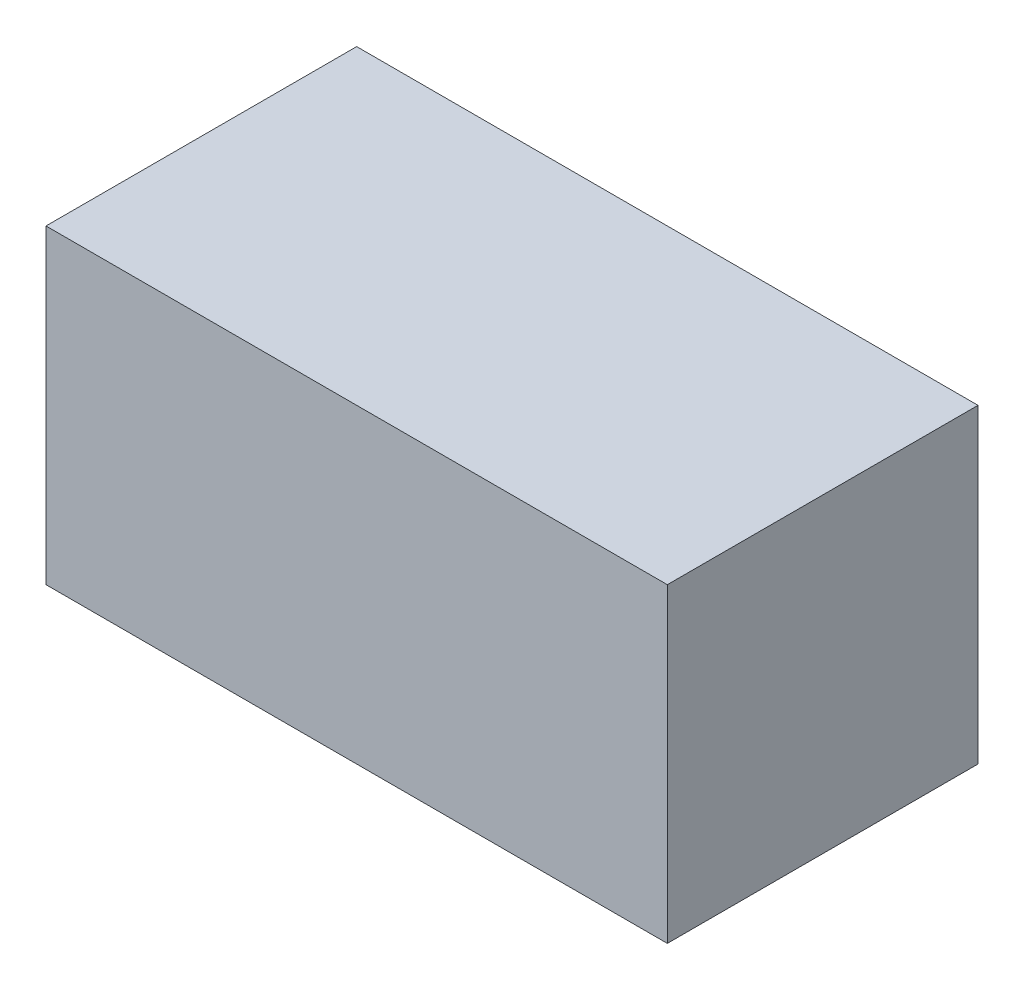
ISO-10303-21;
HEADER;
FILE_DESCRIPTION(('STEP AP214'),'2;1');
FILE_NAME('part.step','',(''),(''),'','','');
FILE_SCHEMA(('AUTOMOTIVE_DESIGN { 1 0 10303 214 1 1 1 1 }'));
ENDSEC;
DATA;
#1=APPLICATION_CONTEXT('core data for automotive mechanical design processes');
#2=APPLICATION_PROTOCOL_DEFINITION('international standard','automotive_design',2000,#1);
#3=PRODUCT_CONTEXT('',#1,'mechanical');
#4=PRODUCT('Part','Part','',(#3));
#5=PRODUCT_RELATED_PRODUCT_CATEGORY('part','',(#4));
#6=PRODUCT_DEFINITION_FORMATION('','',#4);
#7=PRODUCT_DEFINITION_CONTEXT('part definition',#1,'design');
#8=PRODUCT_DEFINITION('design','',#6,#7);
#9=PRODUCT_DEFINITION_SHAPE('','',#8);
#10=(LENGTH_UNIT() NAMED_UNIT(*) SI_UNIT(.MILLI.,.METRE.));
#11=(NAMED_UNIT(*) PLANE_ANGLE_UNIT() SI_UNIT($,.RADIAN.));
#12=(NAMED_UNIT(*) SI_UNIT($,.STERADIAN.) SOLID_ANGLE_UNIT());
#13=UNCERTAINTY_MEASURE_WITH_UNIT(LENGTH_MEASURE(1.E-05),#10,'distance_accuracy_value','');
#14=(GEOMETRIC_REPRESENTATION_CONTEXT(3) GLOBAL_UNCERTAINTY_ASSIGNED_CONTEXT((#13)) GLOBAL_UNIT_ASSIGNED_CONTEXT((#10,
#11,#12)) REPRESENTATION_CONTEXT('',''));
#15=CARTESIAN_POINT('',(0.,0.,0.));
#16=DIRECTION('',(0.,0.,1.));
#17=DIRECTION('',(1.,0.,0.));
#18=AXIS2_PLACEMENT_3D('',#15,#16,#17);
#19=CARTESIAN_POINT('',(-487.279843444227,500.,-247.553816046967));
#20=DIRECTION('',(1.,0.,0.));
#21=DIRECTION('',(0.,0.,-1.));
#22=AXIS2_PLACEMENT_3D('',#19,#20,#21);
#23=PLANE('',#22);
#24=DIRECTION('',(0.,0.,1.));
#25=VECTOR('',#24,1.);
#26=CARTESIAN_POINT('',(-487.279843444227,0.,-247.553816046967));
#27=LINE('',#26,#25);
#28=CARTESIAN_POINT('',(-487.279843444227,0.,-247.553816046967));
#29=VERTEX_POINT('',#28);
#30=CARTESIAN_POINT('',(-487.279843444227,0.,252.446183953033));
#31=VERTEX_POINT('',#30);
#32=EDGE_CURVE('E95',#29,#31,#27,.T.);
#33=ORIENTED_EDGE('',*,*,#32,.T.);
#34=DIRECTION('',(0.,-1.,0.));
#35=VECTOR('',#34,1.);
#36=CARTESIAN_POINT('',(-487.279843444227,500.,252.446183953033));
#37=LINE('',#36,#35);
#38=CARTESIAN_POINT('',(-487.279843444227,500.,252.446183953033));
#39=VERTEX_POINT('',#38);
#40=EDGE_CURVE('E11',#39,#31,#37,.T.);
#41=ORIENTED_EDGE('',*,*,#40,.F.);
#42=DIRECTION('',(0.,0.,1.));
#43=VECTOR('',#42,1.);
#44=CARTESIAN_POINT('',(-487.279843444227,500.,-247.553816046967));
#45=LINE('',#44,#43);
#46=CARTESIAN_POINT('',(-487.279843444227,500.,-247.553816046967));
#47=VERTEX_POINT('',#46);
#48=EDGE_CURVE('E83',#47,#39,#45,.T.);
#49=ORIENTED_EDGE('',*,*,#48,.F.);
#50=DIRECTION('',(0.,-1.,0.));
#51=VECTOR('',#50,1.);
#52=CARTESIAN_POINT('',(-487.279843444227,500.,-247.553816046967));
#53=LINE('',#52,#51);
#54=EDGE_CURVE('E91',#47,#29,#53,.T.);
#55=ORIENTED_EDGE('',*,*,#54,.T.);
#56=EDGE_LOOP('',(#33,#41,#49,#55));
#57=FACE_BOUND('',#56,.T.);
#58=ADVANCED_FACE('F32',(#57),#23,.F.);
#59=CARTESIAN_POINT('',(-487.279843444227,500.,252.446183953033));
#60=DIRECTION('',(0.,0.,-1.));
#61=DIRECTION('',(-1.,0.,0.));
#62=AXIS2_PLACEMENT_3D('',#59,#60,#61);
#63=PLANE('',#62);
#64=DIRECTION('',(1.,0.,0.));
#65=VECTOR('',#64,1.);
#66=CARTESIAN_POINT('',(-487.279843444227,0.,252.446183953033));
#67=LINE('',#66,#65);
#68=CARTESIAN_POINT('',(512.720156555773,0.,252.446183953033));
#69=VERTEX_POINT('',#68);
#70=EDGE_CURVE('E87',#31,#69,#67,.T.);
#71=ORIENTED_EDGE('',*,*,#70,.T.);
#72=DIRECTION('',(0.,-1.,0.));
#73=VECTOR('',#72,1.);
#74=CARTESIAN_POINT('',(512.720156555773,500.,252.446183953033));
#75=LINE('',#74,#73);
#76=CARTESIAN_POINT('',(512.720156555773,500.,252.446183953033));
#77=VERTEX_POINT('',#76);
#78=EDGE_CURVE('E40',#77,#69,#75,.T.);
#79=ORIENTED_EDGE('',*,*,#78,.F.);
#80=DIRECTION('',(1.,0.,0.));
#81=VECTOR('',#80,1.);
#82=CARTESIAN_POINT('',(-487.279843444227,500.,252.446183953033));
#83=LINE('',#82,#81);
#84=EDGE_CURVE('E78',#39,#77,#83,.T.);
#85=ORIENTED_EDGE('',*,*,#84,.F.);
#86=ORIENTED_EDGE('',*,*,#40,.T.);
#87=EDGE_LOOP('',(#71,#79,#85,#86));
#88=FACE_BOUND('',#87,.T.);
#89=ADVANCED_FACE('F86',(#88),#63,.F.);
#90=CARTESIAN_POINT('',(512.720156555773,500.,-247.553816046967));
#91=DIRECTION('',(-1.,0.,0.));
#92=DIRECTION('',(0.,0.,1.));
#93=AXIS2_PLACEMENT_3D('',#90,#91,#92);
#94=PLANE('',#93);
#95=DIRECTION('',(0.,0.,-1.));
#96=VECTOR('',#95,1.);
#97=CARTESIAN_POINT('',(512.720156555773,0.,-247.553816046967));
#98=LINE('',#97,#96);
#99=CARTESIAN_POINT('',(512.720156555773,0.,-247.553816046967));
#100=VERTEX_POINT('',#99);
#101=EDGE_CURVE('E65',#69,#100,#98,.T.);
#102=ORIENTED_EDGE('',*,*,#101,.T.);
#103=DIRECTION('',(0.,-1.,0.));
#104=VECTOR('',#103,1.);
#105=CARTESIAN_POINT('',(512.720156555773,500.,-247.553816046967));
#106=LINE('',#105,#104);
#107=CARTESIAN_POINT('',(512.720156555773,500.,-247.553816046967));
#108=VERTEX_POINT('',#107);
#109=EDGE_CURVE('E88',#108,#100,#106,.T.);
#110=ORIENTED_EDGE('',*,*,#109,.F.);
#111=DIRECTION('',(0.,0.,-1.));
#112=VECTOR('',#111,1.);
#113=CARTESIAN_POINT('',(512.720156555773,500.,-247.553816046967));
#114=LINE('',#113,#112);
#115=EDGE_CURVE('E81',#77,#108,#114,.T.);
#116=ORIENTED_EDGE('',*,*,#115,.F.);
#117=ORIENTED_EDGE('',*,*,#78,.T.);
#118=EDGE_LOOP('',(#102,#110,#116,#117));
#119=FACE_BOUND('',#118,.T.);
#120=ADVANCED_FACE('F89',(#119),#94,.F.);
#121=CARTESIAN_POINT('',(-487.279843444227,500.,-247.553816046967));
#122=DIRECTION('',(0.,0.,1.));
#123=DIRECTION('',(1.,0.,0.));
#124=AXIS2_PLACEMENT_3D('',#121,#122,#123);
#125=PLANE('',#124);
#126=DIRECTION('',(-1.,0.,0.));
#127=VECTOR('',#126,1.);
#128=CARTESIAN_POINT('',(-487.279843444227,0.,-247.553816046967));
#129=LINE('',#128,#127);
#130=EDGE_CURVE('E71',#100,#29,#129,.T.);
#131=ORIENTED_EDGE('',*,*,#130,.T.);
#132=ORIENTED_EDGE('',*,*,#54,.F.);
#133=DIRECTION('',(-1.,0.,0.));
#134=VECTOR('',#133,1.);
#135=CARTESIAN_POINT('',(-487.279843444227,500.,-247.553816046967));
#136=LINE('',#135,#134);
#137=EDGE_CURVE('E48',#108,#47,#136,.T.);
#138=ORIENTED_EDGE('',*,*,#137,.F.);
#139=ORIENTED_EDGE('',*,*,#109,.T.);
#140=EDGE_LOOP('',(#131,#132,#138,#139));
#141=FACE_BOUND('',#140,.T.);
#142=ADVANCED_FACE('F102',(#141),#125,.F.);
#143=CARTESIAN_POINT('',(0.,500.,0.));
#144=DIRECTION('',(0.,1.,0.));
#145=DIRECTION('',(0.,0.,1.));
#146=AXIS2_PLACEMENT_3D('',#143,#144,#145);
#147=PLANE('',#146);
#148=ORIENTED_EDGE('',*,*,#48,.T.);
#149=ORIENTED_EDGE('',*,*,#84,.T.);
#150=ORIENTED_EDGE('',*,*,#115,.T.);
#151=ORIENTED_EDGE('',*,*,#137,.T.);
#152=EDGE_LOOP('',(#148,#149,#150,#151));
#153=FACE_BOUND('',#152,.T.);
#154=ADVANCED_FACE('F79',(#153),#147,.T.);
#155=CARTESIAN_POINT('',(0.,0.,0.));
#156=DIRECTION('',(0.,1.,0.));
#157=DIRECTION('',(0.,0.,1.));
#158=AXIS2_PLACEMENT_3D('',#155,#156,#157);
#159=PLANE('',#158);
#160=ORIENTED_EDGE('',*,*,#32,.F.);
#161=ORIENTED_EDGE('',*,*,#130,.F.);
#162=ORIENTED_EDGE('',*,*,#101,.F.);
#163=ORIENTED_EDGE('',*,*,#70,.F.);
#164=EDGE_LOOP('',(#160,#161,#162,#163));
#165=FACE_BOUND('',#164,.T.);
#166=ADVANCED_FACE('F105',(#165),#159,.F.);
#167=CLOSED_SHELL('',(#58,#89,#120,#142,#154,#166));
#168=MANIFOLD_SOLID_BREP('B2',#167);
#169=ADVANCED_BREP_SHAPE_REPRESENTATION('',(#18,#168),#14);
#170=SHAPE_DEFINITION_REPRESENTATION(#9,#169);
ENDSEC;
END-ISO-10303-21;
